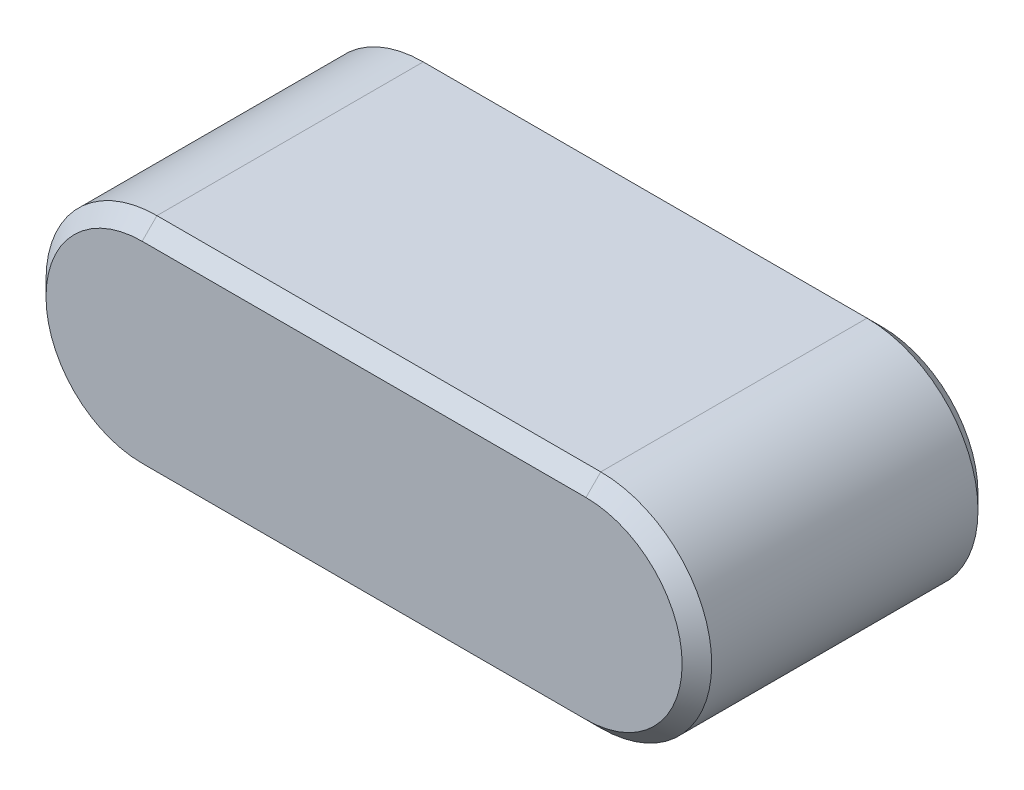
ISO-10303-21;
HEADER;
FILE_DESCRIPTION(('STEP AP214'),'2;1');
FILE_NAME('part.step','',(''),(''),'','','');
FILE_SCHEMA(('AUTOMOTIVE_DESIGN { 1 0 10303 214 1 1 1 1 }'));
ENDSEC;
DATA;
#1=APPLICATION_CONTEXT('core data for automotive mechanical design processes');
#2=APPLICATION_PROTOCOL_DEFINITION('international standard','automotive_design',2000,#1);
#3=PRODUCT_CONTEXT('',#1,'mechanical');
#4=PRODUCT('Part','Part','',(#3));
#5=PRODUCT_RELATED_PRODUCT_CATEGORY('part','',(#4));
#6=PRODUCT_DEFINITION_FORMATION('','',#4);
#7=PRODUCT_DEFINITION_CONTEXT('part definition',#1,'design');
#8=PRODUCT_DEFINITION('design','',#6,#7);
#9=PRODUCT_DEFINITION_SHAPE('','',#8);
#10=(LENGTH_UNIT() NAMED_UNIT(*) SI_UNIT(.MILLI.,.METRE.));
#11=(NAMED_UNIT(*) PLANE_ANGLE_UNIT() SI_UNIT($,.RADIAN.));
#12=(NAMED_UNIT(*) SI_UNIT($,.STERADIAN.) SOLID_ANGLE_UNIT());
#13=UNCERTAINTY_MEASURE_WITH_UNIT(LENGTH_MEASURE(1.E-05),#10,'distance_accuracy_value','');
#14=(GEOMETRIC_REPRESENTATION_CONTEXT(3) GLOBAL_UNCERTAINTY_ASSIGNED_CONTEXT((#13)) GLOBAL_UNIT_ASSIGNED_CONTEXT((#10,
#11,#12)) REPRESENTATION_CONTEXT('',''));
#15=CARTESIAN_POINT('',(0.,0.,0.));
#16=DIRECTION('',(0.,0.,1.));
#17=DIRECTION('',(1.,0.,0.));
#18=AXIS2_PLACEMENT_3D('',#15,#16,#17);
#19=CARTESIAN_POINT('',(-3.,0.,4.));
#20=DIRECTION('',(0.,0.,-1.));
#21=DIRECTION('',(-1.,0.,0.));
#22=AXIS2_PLACEMENT_3D('',#19,#20,#21);
#23=CYLINDRICAL_SURFACE('',#22,1.5);
#24=DIRECTION('',(0.,0.,-1.));
#25=VECTOR('',#24,1.);
#26=CARTESIAN_POINT('',(-3.,1.5,4.));
#27=LINE('',#26,#25);
#28=CARTESIAN_POINT('',(-3.,1.5,3.8));
#29=VERTEX_POINT('',#28);
#30=CARTESIAN_POINT('',(-3.,1.5,0.200000000000001));
#31=VERTEX_POINT('',#30);
#32=EDGE_CURVE('E108',#29,#31,#27,.T.);
#33=ORIENTED_EDGE('',*,*,#32,.T.);
#34=CARTESIAN_POINT('',(-3.,0.,0.200000000000001));
#35=DIRECTION('',(0.,0.,1.));
#36=DIRECTION('',(1.,0.,0.));
#37=AXIS2_PLACEMENT_3D('',#34,#35,#36);
#38=CIRCLE('',#37,1.5);
#39=CARTESIAN_POINT('',(-3.,-1.5,0.200000000000001));
#40=VERTEX_POINT('',#39);
#41=EDGE_CURVE('E115',#31,#40,#38,.T.);
#42=ORIENTED_EDGE('',*,*,#41,.T.);
#43=DIRECTION('',(0.,0.,-1.));
#44=VECTOR('',#43,1.);
#45=CARTESIAN_POINT('',(-3.,-1.5,4.));
#46=LINE('',#45,#44);
#47=CARTESIAN_POINT('',(-3.,-1.5,3.8));
#48=VERTEX_POINT('',#47);
#49=EDGE_CURVE('E110',#48,#40,#46,.T.);
#50=ORIENTED_EDGE('',*,*,#49,.F.);
#51=CARTESIAN_POINT('',(-3.,0.,3.8));
#52=DIRECTION('',(0.,0.,1.));
#53=DIRECTION('',(1.,0.,0.));
#54=AXIS2_PLACEMENT_3D('',#51,#52,#53);
#55=CIRCLE('',#54,1.5);
#56=EDGE_CURVE('E106',#48,#29,#55,.F.);
#57=ORIENTED_EDGE('',*,*,#56,.T.);
#58=EDGE_LOOP('',(#33,#42,#50,#57));
#59=FACE_BOUND('',#58,.T.);
#60=ADVANCED_FACE('F39',(#59),#23,.T.);
#61=CARTESIAN_POINT('',(-3.,-1.5,4.));
#62=DIRECTION('',(0.,1.,0.));
#63=DIRECTION('',(-1.,0.,0.));
#64=AXIS2_PLACEMENT_3D('',#61,#62,#63);
#65=PLANE('',#64);
#66=ORIENTED_EDGE('',*,*,#49,.T.);
#67=DIRECTION('',(1.,0.,0.));
#68=VECTOR('',#67,1.);
#69=CARTESIAN_POINT('',(-3.,-1.5,0.200000000000001));
#70=LINE('',#69,#68);
#71=CARTESIAN_POINT('',(3.,-1.5,0.200000000000001));
#72=VERTEX_POINT('',#71);
#73=EDGE_CURVE('E116',#40,#72,#70,.T.);
#74=ORIENTED_EDGE('',*,*,#73,.T.);
#75=DIRECTION('',(0.,0.,-1.));
#76=VECTOR('',#75,1.);
#77=CARTESIAN_POINT('',(3.,-1.5,4.));
#78=LINE('',#77,#76);
#79=CARTESIAN_POINT('',(3.,-1.5,3.8));
#80=VERTEX_POINT('',#79);
#81=EDGE_CURVE('E202',#80,#72,#78,.T.);
#82=ORIENTED_EDGE('',*,*,#81,.F.);
#83=DIRECTION('',(-1.,0.,0.));
#84=VECTOR('',#83,1.);
#85=CARTESIAN_POINT('',(-3.,-1.5,3.8));
#86=LINE('',#85,#84);
#87=EDGE_CURVE('E189',#80,#48,#86,.T.);
#88=ORIENTED_EDGE('',*,*,#87,.T.);
#89=EDGE_LOOP('',(#66,#74,#82,#88));
#90=FACE_BOUND('',#89,.T.);
#91=ADVANCED_FACE('F204',(#90),#65,.F.);
#92=CARTESIAN_POINT('',(3.,0.,4.));
#93=DIRECTION('',(0.,0.,-1.));
#94=DIRECTION('',(-1.,0.,0.));
#95=AXIS2_PLACEMENT_3D('',#92,#93,#94);
#96=CYLINDRICAL_SURFACE('',#95,1.5);
#97=ORIENTED_EDGE('',*,*,#81,.T.);
#98=CARTESIAN_POINT('',(3.,0.,0.200000000000001));
#99=DIRECTION('',(0.,0.,1.));
#100=DIRECTION('',(1.,0.,0.));
#101=AXIS2_PLACEMENT_3D('',#98,#99,#100);
#102=CIRCLE('',#101,1.5);
#103=CARTESIAN_POINT('',(3.,1.5,0.200000000000001));
#104=VERTEX_POINT('',#103);
#105=EDGE_CURVE('E171',#72,#104,#102,.T.);
#106=ORIENTED_EDGE('',*,*,#105,.T.);
#107=DIRECTION('',(0.,0.,-1.));
#108=VECTOR('',#107,1.);
#109=CARTESIAN_POINT('',(3.,1.5,4.));
#110=LINE('',#109,#108);
#111=CARTESIAN_POINT('',(3.,1.5,3.8));
#112=VERTEX_POINT('',#111);
#113=EDGE_CURVE('E128',#112,#104,#110,.T.);
#114=ORIENTED_EDGE('',*,*,#113,.F.);
#115=CARTESIAN_POINT('',(3.,0.,3.8));
#116=DIRECTION('',(0.,0.,1.));
#117=DIRECTION('',(1.,0.,0.));
#118=AXIS2_PLACEMENT_3D('',#115,#116,#117);
#119=CIRCLE('',#118,1.5);
#120=EDGE_CURVE('E186',#112,#80,#119,.F.);
#121=ORIENTED_EDGE('',*,*,#120,.T.);
#122=EDGE_LOOP('',(#97,#106,#114,#121));
#123=FACE_BOUND('',#122,.T.);
#124=ADVANCED_FACE('F201',(#123),#96,.T.);
#125=CARTESIAN_POINT('',(-3.,1.5,4.));
#126=DIRECTION('',(0.,-1.,0.));
#127=DIRECTION('',(1.,0.,0.));
#128=AXIS2_PLACEMENT_3D('',#125,#126,#127);
#129=PLANE('',#128);
#130=ORIENTED_EDGE('',*,*,#113,.T.);
#131=DIRECTION('',(-1.,0.,0.));
#132=VECTOR('',#131,1.);
#133=CARTESIAN_POINT('',(-3.,1.5,0.200000000000001));
#134=LINE('',#133,#132);
#135=EDGE_CURVE('E127',#104,#31,#134,.T.);
#136=ORIENTED_EDGE('',*,*,#135,.T.);
#137=ORIENTED_EDGE('',*,*,#32,.F.);
#138=DIRECTION('',(1.,0.,0.));
#139=VECTOR('',#138,1.);
#140=CARTESIAN_POINT('',(3.,1.5,3.8));
#141=LINE('',#140,#139);
#142=EDGE_CURVE('E124',#29,#112,#141,.T.);
#143=ORIENTED_EDGE('',*,*,#142,.T.);
#144=EDGE_LOOP('',(#130,#136,#137,#143));
#145=FACE_BOUND('',#144,.T.);
#146=ADVANCED_FACE('F123',(#145),#129,.F.);
#147=CARTESIAN_POINT('',(-3.,0.,4.));
#148=DIRECTION('',(0.,0.,1.));
#149=DIRECTION('',(1.,0.,0.));
#150=AXIS2_PLACEMENT_3D('',#147,#148,#149);
#151=PLANE('',#150);
#152=CARTESIAN_POINT('',(3.,0.,4.));
#153=DIRECTION('',(0.,0.,1.));
#154=DIRECTION('',(1.,0.,0.));
#155=AXIS2_PLACEMENT_3D('',#152,#153,#154);
#156=CIRCLE('',#155,1.3);
#157=CARTESIAN_POINT('',(3.,-1.3,4.));
#158=VERTEX_POINT('',#157);
#159=CARTESIAN_POINT('',(3.,1.3,4.));
#160=VERTEX_POINT('',#159);
#161=EDGE_CURVE('E49',#158,#160,#156,.T.);
#162=ORIENTED_EDGE('',*,*,#161,.T.);
#163=DIRECTION('',(-1.,0.,0.));
#164=VECTOR('',#163,1.);
#165=CARTESIAN_POINT('',(-3.,1.3,4.));
#166=LINE('',#165,#164);
#167=CARTESIAN_POINT('',(-3.,1.3,4.));
#168=VERTEX_POINT('',#167);
#169=EDGE_CURVE('E11',#160,#168,#166,.T.);
#170=ORIENTED_EDGE('',*,*,#169,.T.);
#171=CARTESIAN_POINT('',(-3.,0.,4.));
#172=DIRECTION('',(0.,0.,1.));
#173=DIRECTION('',(1.,0.,0.));
#174=AXIS2_PLACEMENT_3D('',#171,#172,#173);
#175=CIRCLE('',#174,1.3);
#176=CARTESIAN_POINT('',(-3.,-1.3,4.));
#177=VERTEX_POINT('',#176);
#178=EDGE_CURVE('E140',#168,#177,#175,.T.);
#179=ORIENTED_EDGE('',*,*,#178,.T.);
#180=DIRECTION('',(1.,0.,0.));
#181=VECTOR('',#180,1.);
#182=CARTESIAN_POINT('',(3.,-1.3,4.));
#183=LINE('',#182,#181);
#184=EDGE_CURVE('E60',#177,#158,#183,.T.);
#185=ORIENTED_EDGE('',*,*,#184,.T.);
#186=EDGE_LOOP('',(#162,#170,#179,#185));
#187=FACE_BOUND('',#186,.T.);
#188=ADVANCED_FACE('F194',(#187),#151,.T.);
#189=CARTESIAN_POINT('',(-3.,0.,0.));
#190=DIRECTION('',(0.,0.,1.));
#191=DIRECTION('',(1.,0.,0.));
#192=AXIS2_PLACEMENT_3D('',#189,#190,#191);
#193=PLANE('',#192);
#194=CARTESIAN_POINT('',(-3.,0.,0.));
#195=DIRECTION('',(0.,0.,1.));
#196=DIRECTION('',(1.,0.,0.));
#197=AXIS2_PLACEMENT_3D('',#194,#195,#196);
#198=CIRCLE('',#197,1.3);
#199=CARTESIAN_POINT('',(-3.,-1.3,0.));
#200=VERTEX_POINT('',#199);
#201=CARTESIAN_POINT('',(-3.,1.3,0.));
#202=VERTEX_POINT('',#201);
#203=EDGE_CURVE('E178',#200,#202,#198,.F.);
#204=ORIENTED_EDGE('',*,*,#203,.T.);
#205=DIRECTION('',(1.,0.,0.));
#206=VECTOR('',#205,1.);
#207=CARTESIAN_POINT('',(-3.,1.3,0.));
#208=LINE('',#207,#206);
#209=CARTESIAN_POINT('',(3.,1.3,0.));
#210=VERTEX_POINT('',#209);
#211=EDGE_CURVE('E180',#202,#210,#208,.T.);
#212=ORIENTED_EDGE('',*,*,#211,.T.);
#213=CARTESIAN_POINT('',(3.,0.,0.));
#214=DIRECTION('',(0.,0.,1.));
#215=DIRECTION('',(1.,0.,0.));
#216=AXIS2_PLACEMENT_3D('',#213,#214,#215);
#217=CIRCLE('',#216,1.3);
#218=CARTESIAN_POINT('',(3.,-1.3,0.));
#219=VERTEX_POINT('',#218);
#220=EDGE_CURVE('E169',#210,#219,#217,.F.);
#221=ORIENTED_EDGE('',*,*,#220,.T.);
#222=DIRECTION('',(-1.,0.,0.));
#223=VECTOR('',#222,1.);
#224=CARTESIAN_POINT('',(-3.,-1.3,0.));
#225=LINE('',#224,#223);
#226=EDGE_CURVE('E176',#219,#200,#225,.T.);
#227=ORIENTED_EDGE('',*,*,#226,.T.);
#228=EDGE_LOOP('',(#204,#212,#221,#227));
#229=FACE_BOUND('',#228,.T.);
#230=ADVANCED_FACE('F229',(#229),#193,.F.);
#231=CARTESIAN_POINT('',(-3.,-1.5,0.200000000000001));
#232=DIRECTION('',(0.,0.707106781186546,0.707106781186549));
#233=DIRECTION('',(1.,0.,0.));
#234=AXIS2_PLACEMENT_3D('',#231,#232,#233);
#235=PLANE('',#234);
#236=DIRECTION('',(0.,-0.707106781186549,0.707106781186546));
#237=VECTOR('',#236,1.);
#238=CARTESIAN_POINT('',(-3.,-1.3,0.));
#239=LINE('',#238,#237);
#240=EDGE_CURVE('E155',#200,#40,#239,.T.);
#241=ORIENTED_EDGE('',*,*,#240,.F.);
#242=ORIENTED_EDGE('',*,*,#226,.F.);
#243=DIRECTION('',(0.,0.707106781186549,-0.707106781186546));
#244=VECTOR('',#243,1.);
#245=CARTESIAN_POINT('',(3.,-1.5,0.200000000000001));
#246=LINE('',#245,#244);
#247=EDGE_CURVE('E129',#72,#219,#246,.T.);
#248=ORIENTED_EDGE('',*,*,#247,.F.);
#249=ORIENTED_EDGE('',*,*,#73,.F.);
#250=EDGE_LOOP('',(#241,#242,#248,#249));
#251=FACE_BOUND('',#250,.T.);
#252=ADVANCED_FACE('F175',(#251),#235,.F.);
#253=CARTESIAN_POINT('',(3.,0.,0.200000000000001));
#254=DIRECTION('',(0.,0.,1.));
#255=DIRECTION('',(1.,0.,0.));
#256=AXIS2_PLACEMENT_3D('',#253,#254,#255);
#257=CONICAL_SURFACE('',#256,1.5,0.78539816339745);
#258=ORIENTED_EDGE('',*,*,#247,.T.);
#259=ORIENTED_EDGE('',*,*,#220,.F.);
#260=DIRECTION('',(0.,-0.707106781186549,-0.707106781186546));
#261=VECTOR('',#260,1.);
#262=CARTESIAN_POINT('',(3.,1.5,0.200000000000001));
#263=LINE('',#262,#261);
#264=EDGE_CURVE('E149',#104,#210,#263,.T.);
#265=ORIENTED_EDGE('',*,*,#264,.F.);
#266=ORIENTED_EDGE('',*,*,#105,.F.);
#267=EDGE_LOOP('',(#258,#259,#265,#266));
#268=FACE_BOUND('',#267,.T.);
#269=ADVANCED_FACE('F167',(#268),#257,.T.);
#270=CARTESIAN_POINT('',(-3.,0.,0.200000000000001));
#271=DIRECTION('',(0.,0.,1.));
#272=DIRECTION('',(1.,0.,0.));
#273=AXIS2_PLACEMENT_3D('',#270,#271,#272);
#274=CONICAL_SURFACE('',#273,1.5,0.78539816339745);
#275=ORIENTED_EDGE('',*,*,#240,.T.);
#276=ORIENTED_EDGE('',*,*,#41,.F.);
#277=DIRECTION('',(0.,0.707106781186549,0.707106781186546));
#278=VECTOR('',#277,1.);
#279=CARTESIAN_POINT('',(-3.,1.3,0.));
#280=LINE('',#279,#278);
#281=EDGE_CURVE('E147',#202,#31,#280,.T.);
#282=ORIENTED_EDGE('',*,*,#281,.F.);
#283=ORIENTED_EDGE('',*,*,#203,.F.);
#284=EDGE_LOOP('',(#275,#276,#282,#283));
#285=FACE_BOUND('',#284,.T.);
#286=ADVANCED_FACE('F210',(#285),#274,.T.);
#287=CARTESIAN_POINT('',(-3.,1.5,0.200000000000001));
#288=DIRECTION('',(0.,-0.707106781186546,0.707106781186549));
#289=DIRECTION('',(-1.,0.,0.));
#290=AXIS2_PLACEMENT_3D('',#287,#288,#289);
#291=PLANE('',#290);
#292=ORIENTED_EDGE('',*,*,#264,.T.);
#293=ORIENTED_EDGE('',*,*,#211,.F.);
#294=ORIENTED_EDGE('',*,*,#281,.T.);
#295=ORIENTED_EDGE('',*,*,#135,.F.);
#296=EDGE_LOOP('',(#292,#293,#294,#295));
#297=FACE_BOUND('',#296,.T.);
#298=ADVANCED_FACE('F208',(#297),#291,.F.);
#299=CARTESIAN_POINT('',(-3.,-1.3,4.));
#300=DIRECTION('',(0.,-0.707106781186551,0.707106781186544));
#301=DIRECTION('',(-1.,0.,0.));
#302=AXIS2_PLACEMENT_3D('',#299,#300,#301);
#303=PLANE('',#302);
#304=DIRECTION('',(0.,0.707106781186544,0.707106781186551));
#305=VECTOR('',#304,1.);
#306=CARTESIAN_POINT('',(-3.,-1.5,3.8));
#307=LINE('',#306,#305);
#308=EDGE_CURVE('E142',#48,#177,#307,.T.);
#309=ORIENTED_EDGE('',*,*,#308,.F.);
#310=ORIENTED_EDGE('',*,*,#87,.F.);
#311=DIRECTION('',(0.,-0.707106781186544,-0.707106781186551));
#312=VECTOR('',#311,1.);
#313=CARTESIAN_POINT('',(3.,-1.3,4.));
#314=LINE('',#313,#312);
#315=EDGE_CURVE('E44',#158,#80,#314,.T.);
#316=ORIENTED_EDGE('',*,*,#315,.F.);
#317=ORIENTED_EDGE('',*,*,#184,.F.);
#318=EDGE_LOOP('',(#309,#310,#316,#317));
#319=FACE_BOUND('',#318,.T.);
#320=ADVANCED_FACE('F42',(#319),#303,.T.);
#321=CARTESIAN_POINT('',(3.,0.,4.));
#322=DIRECTION('',(0.,0.,-1.));
#323=DIRECTION('',(-1.,0.,0.));
#324=AXIS2_PLACEMENT_3D('',#321,#322,#323);
#325=CONICAL_SURFACE('',#324,1.3,0.785398163397444);
#326=ORIENTED_EDGE('',*,*,#315,.T.);
#327=ORIENTED_EDGE('',*,*,#120,.F.);
#328=DIRECTION('',(0.,0.707106781186544,-0.707106781186551));
#329=VECTOR('',#328,1.);
#330=CARTESIAN_POINT('',(3.,1.3,4.));
#331=LINE('',#330,#329);
#332=EDGE_CURVE('E136',#160,#112,#331,.T.);
#333=ORIENTED_EDGE('',*,*,#332,.F.);
#334=ORIENTED_EDGE('',*,*,#161,.F.);
#335=EDGE_LOOP('',(#326,#327,#333,#334));
#336=FACE_BOUND('',#335,.T.);
#337=ADVANCED_FACE('F197',(#336),#325,.T.);
#338=CARTESIAN_POINT('',(-3.,0.,4.));
#339=DIRECTION('',(0.,0.,-1.));
#340=DIRECTION('',(-1.,0.,0.));
#341=AXIS2_PLACEMENT_3D('',#338,#339,#340);
#342=CONICAL_SURFACE('',#341,1.3,0.785398163397444);
#343=ORIENTED_EDGE('',*,*,#308,.T.);
#344=ORIENTED_EDGE('',*,*,#178,.F.);
#345=DIRECTION('',(0.,-0.707106781186544,0.707106781186551));
#346=VECTOR('',#345,1.);
#347=CARTESIAN_POINT('',(-3.,1.5,3.8));
#348=LINE('',#347,#346);
#349=EDGE_CURVE('E134',#29,#168,#348,.T.);
#350=ORIENTED_EDGE('',*,*,#349,.F.);
#351=ORIENTED_EDGE('',*,*,#56,.F.);
#352=EDGE_LOOP('',(#343,#344,#350,#351));
#353=FACE_BOUND('',#352,.T.);
#354=ADVANCED_FACE('F139',(#353),#342,.T.);
#355=CARTESIAN_POINT('',(-3.,1.3,4.));
#356=DIRECTION('',(0.,0.707106781186551,0.707106781186544));
#357=DIRECTION('',(1.,0.,0.));
#358=AXIS2_PLACEMENT_3D('',#355,#356,#357);
#359=PLANE('',#358);
#360=ORIENTED_EDGE('',*,*,#332,.T.);
#361=ORIENTED_EDGE('',*,*,#142,.F.);
#362=ORIENTED_EDGE('',*,*,#349,.T.);
#363=ORIENTED_EDGE('',*,*,#169,.F.);
#364=EDGE_LOOP('',(#360,#361,#362,#363));
#365=FACE_BOUND('',#364,.T.);
#366=ADVANCED_FACE('F132',(#365),#359,.T.);
#367=CLOSED_SHELL('',(#60,#91,#124,#146,#188,#230,#252,#269,#286,#298,#320,#337,#354,#366));
#368=MANIFOLD_SOLID_BREP('B2',#367);
#369=ADVANCED_BREP_SHAPE_REPRESENTATION('',(#18,#368),#14);
#370=SHAPE_DEFINITION_REPRESENTATION(#9,#369);
ENDSEC;
END-ISO-10303-21;
